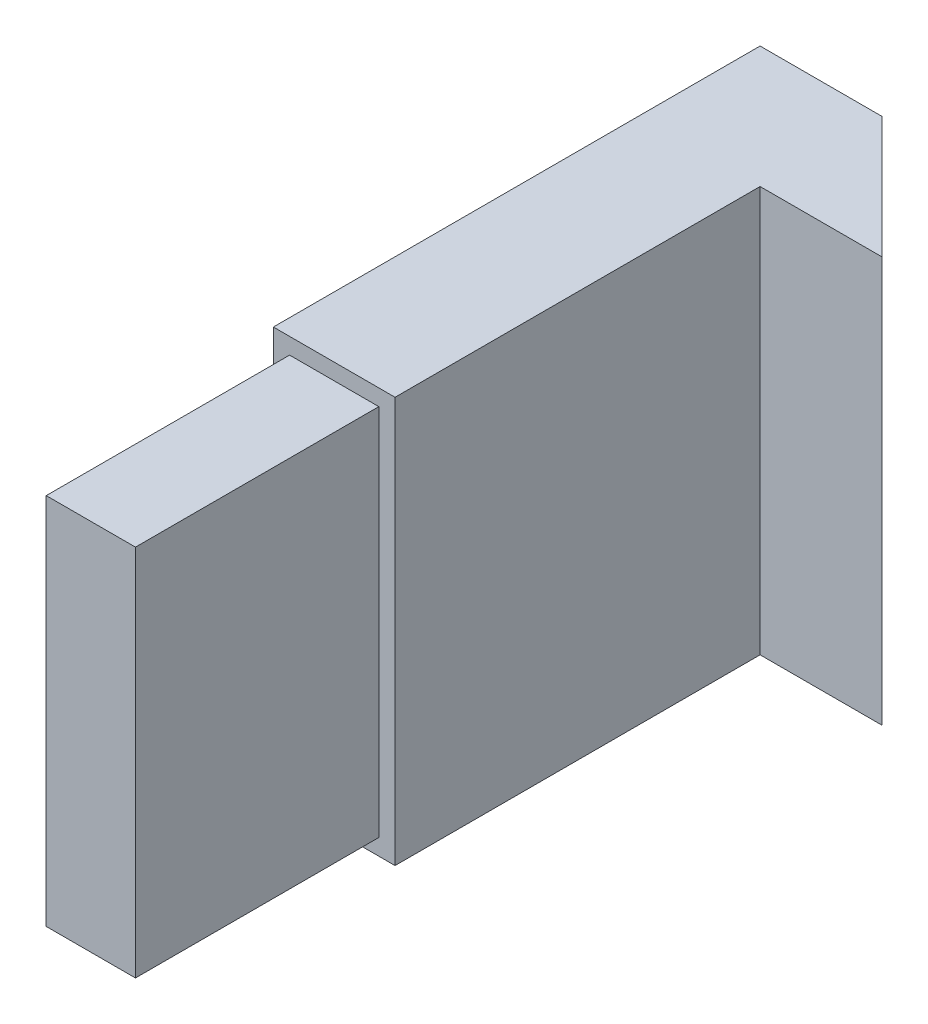
ISO-10303-21;
HEADER;
FILE_DESCRIPTION(('STEP AP214'),'2;1');
FILE_NAME('part.step','',(''),(''),'','','');
FILE_SCHEMA(('AUTOMOTIVE_DESIGN { 1 0 10303 214 1 1 1 1 }'));
ENDSEC;
DATA;
#1=APPLICATION_CONTEXT('core data for automotive mechanical design processes');
#2=APPLICATION_PROTOCOL_DEFINITION('international standard','automotive_design',2000,#1);
#3=PRODUCT_CONTEXT('',#1,'mechanical');
#4=PRODUCT('Part','Part','',(#3));
#5=PRODUCT_RELATED_PRODUCT_CATEGORY('part','',(#4));
#6=PRODUCT_DEFINITION_FORMATION('','',#4);
#7=PRODUCT_DEFINITION_CONTEXT('part definition',#1,'design');
#8=PRODUCT_DEFINITION('design','',#6,#7);
#9=PRODUCT_DEFINITION_SHAPE('','',#8);
#10=(LENGTH_UNIT() NAMED_UNIT(*) SI_UNIT(.MILLI.,.METRE.));
#11=(NAMED_UNIT(*) PLANE_ANGLE_UNIT() SI_UNIT($,.RADIAN.));
#12=(NAMED_UNIT(*) SI_UNIT($,.STERADIAN.) SOLID_ANGLE_UNIT());
#13=UNCERTAINTY_MEASURE_WITH_UNIT(LENGTH_MEASURE(1.E-05),#10,'distance_accuracy_value','');
#14=(GEOMETRIC_REPRESENTATION_CONTEXT(3) GLOBAL_UNCERTAINTY_ASSIGNED_CONTEXT((#13)) GLOBAL_UNIT_ASSIGNED_CONTEXT((#10,
#11,#12)) REPRESENTATION_CONTEXT('',''));
#15=CARTESIAN_POINT('',(0.,0.,0.));
#16=DIRECTION('',(0.,0.,1.));
#17=DIRECTION('',(1.,0.,0.));
#18=AXIS2_PLACEMENT_3D('',#15,#16,#17);
#19=CARTESIAN_POINT('',(0.,5.,3.));
#20=DIRECTION('',(0.,0.,-1.));
#21=DIRECTION('',(-1.,0.,0.));
#22=AXIS2_PLACEMENT_3D('',#19,#20,#21);
#23=PLANE('',#22);
#24=DIRECTION('',(1.,0.,0.));
#25=VECTOR('',#24,1.);
#26=CARTESIAN_POINT('',(0.,0.,3.));
#27=LINE('',#26,#25);
#28=CARTESIAN_POINT('',(-0.749999999999999,0.,3.));
#29=VERTEX_POINT('',#28);
#30=CARTESIAN_POINT('',(0.75,0.,3.));
#31=VERTEX_POINT('',#30);
#32=EDGE_CURVE('E145',#29,#31,#27,.T.);
#33=ORIENTED_EDGE('',*,*,#32,.T.);
#34=DIRECTION('',(0.,-1.,0.));
#35=VECTOR('',#34,1.);
#36=CARTESIAN_POINT('',(0.75,5.,3.));
#37=LINE('',#36,#35);
#38=CARTESIAN_POINT('',(0.75,5.,3.));
#39=VERTEX_POINT('',#38);
#40=EDGE_CURVE('E155',#39,#31,#37,.T.);
#41=ORIENTED_EDGE('',*,*,#40,.F.);
#42=DIRECTION('',(1.,0.,0.));
#43=VECTOR('',#42,1.);
#44=CARTESIAN_POINT('',(0.,5.,3.));
#45=LINE('',#44,#43);
#46=CARTESIAN_POINT('',(-0.749999999999999,5.,3.));
#47=VERTEX_POINT('',#46);
#48=EDGE_CURVE('E154',#47,#39,#45,.T.);
#49=ORIENTED_EDGE('',*,*,#48,.F.);
#50=DIRECTION('',(0.,-1.,0.));
#51=VECTOR('',#50,1.);
#52=CARTESIAN_POINT('',(-0.749999999999999,5.,3.));
#53=LINE('',#52,#51);
#54=EDGE_CURVE('E169',#47,#29,#53,.T.);
#55=ORIENTED_EDGE('',*,*,#54,.T.);
#56=EDGE_LOOP('',(#33,#41,#49,#55));
#57=FACE_BOUND('',#56,.T.);
#58=DIRECTION('',(0.,-1.,0.));
#59=VECTOR('',#58,1.);
#60=CARTESIAN_POINT('',(-0.549999999999999,4.8,3.));
#61=LINE('',#60,#59);
#62=CARTESIAN_POINT('',(-0.549999999999999,4.8,3.));
#63=VERTEX_POINT('',#62);
#64=CARTESIAN_POINT('',(-0.549999999999999,0.2,3.));
#65=VERTEX_POINT('',#64);
#66=EDGE_CURVE('E131',#63,#65,#61,.T.);
#67=ORIENTED_EDGE('',*,*,#66,.F.);
#68=DIRECTION('',(-1.,0.,0.));
#69=VECTOR('',#68,1.);
#70=CARTESIAN_POINT('',(0.55,4.8,3.));
#71=LINE('',#70,#69);
#72=CARTESIAN_POINT('',(0.55,4.8,3.));
#73=VERTEX_POINT('',#72);
#74=EDGE_CURVE('E128',#73,#63,#71,.T.);
#75=ORIENTED_EDGE('',*,*,#74,.F.);
#76=DIRECTION('',(0.,1.,0.));
#77=VECTOR('',#76,1.);
#78=CARTESIAN_POINT('',(0.55,0.2,3.));
#79=LINE('',#78,#77);
#80=CARTESIAN_POINT('',(0.55,0.2,3.));
#81=VERTEX_POINT('',#80);
#82=EDGE_CURVE('E55',#81,#73,#79,.T.);
#83=ORIENTED_EDGE('',*,*,#82,.F.);
#84=DIRECTION('',(1.,0.,0.));
#85=VECTOR('',#84,1.);
#86=CARTESIAN_POINT('',(-0.549999999999999,0.2,3.));
#87=LINE('',#86,#85);
#88=EDGE_CURVE('E50',#65,#81,#87,.T.);
#89=ORIENTED_EDGE('',*,*,#88,.F.);
#90=EDGE_LOOP('',(#67,#75,#83,#89));
#91=FACE_BOUND('',#90,.T.);
#92=ADVANCED_FACE('F35',(#57,#91),#23,.F.);
#93=CARTESIAN_POINT('',(0.75,5.,0.));
#94=DIRECTION('',(1.,0.,0.));
#95=DIRECTION('',(0.,0.,-1.));
#96=AXIS2_PLACEMENT_3D('',#93,#94,#95);
#97=PLANE('',#96);
#98=DIRECTION('',(0.,0.,1.));
#99=VECTOR('',#98,1.);
#100=CARTESIAN_POINT('',(0.75,0.,0.));
#101=LINE('',#100,#99);
#102=CARTESIAN_POINT('',(0.75,0.,-1.5));
#103=VERTEX_POINT('',#102);
#104=EDGE_CURVE('E132',#103,#31,#101,.T.);
#105=ORIENTED_EDGE('',*,*,#104,.F.);
#106=DIRECTION('',(0.,-1.,0.));
#107=VECTOR('',#106,1.);
#108=CARTESIAN_POINT('',(0.75,5.,-1.5));
#109=LINE('',#108,#107);
#110=CARTESIAN_POINT('',(0.75,5.,-1.5));
#111=VERTEX_POINT('',#110);
#112=EDGE_CURVE('E11',#111,#103,#109,.T.);
#113=ORIENTED_EDGE('',*,*,#112,.F.);
#114=DIRECTION('',(0.,0.,1.));
#115=VECTOR('',#114,1.);
#116=CARTESIAN_POINT('',(0.75,5.,0.));
#117=LINE('',#116,#115);
#118=EDGE_CURVE('E141',#111,#39,#117,.T.);
#119=ORIENTED_EDGE('',*,*,#118,.T.);
#120=ORIENTED_EDGE('',*,*,#40,.T.);
#121=EDGE_LOOP('',(#105,#113,#119,#120));
#122=FACE_BOUND('',#121,.T.);
#123=ADVANCED_FACE('F37',(#122),#97,.T.);
#124=CARTESIAN_POINT('',(0.,5.,-1.5));
#125=DIRECTION('',(0.,0.,-1.));
#126=DIRECTION('',(-1.,0.,0.));
#127=AXIS2_PLACEMENT_3D('',#124,#125,#126);
#128=PLANE('',#127);
#129=DIRECTION('',(1.,0.,0.));
#130=VECTOR('',#129,1.);
#131=CARTESIAN_POINT('',(0.,0.,-1.5));
#132=LINE('',#131,#130);
#133=CARTESIAN_POINT('',(2.25,0.,-1.5));
#134=VERTEX_POINT('',#133);
#135=EDGE_CURVE('E135',#103,#134,#132,.T.);
#136=ORIENTED_EDGE('',*,*,#135,.T.);
#137=DIRECTION('',(0.,-1.,0.));
#138=VECTOR('',#137,1.);
#139=CARTESIAN_POINT('',(2.25,5.,-1.5));
#140=LINE('',#139,#138);
#141=CARTESIAN_POINT('',(2.25,5.,-1.5));
#142=VERTEX_POINT('',#141);
#143=EDGE_CURVE('E43',#142,#134,#140,.T.);
#144=ORIENTED_EDGE('',*,*,#143,.F.);
#145=DIRECTION('',(1.,0.,0.));
#146=VECTOR('',#145,1.);
#147=CARTESIAN_POINT('',(0.,5.,-1.5));
#148=LINE('',#147,#146);
#149=EDGE_CURVE('E144',#111,#142,#148,.T.);
#150=ORIENTED_EDGE('',*,*,#149,.F.);
#151=ORIENTED_EDGE('',*,*,#112,.T.);
#152=EDGE_LOOP('',(#136,#144,#150,#151));
#153=FACE_BOUND('',#152,.T.);
#154=ADVANCED_FACE('F199',(#153),#128,.F.);
#155=CARTESIAN_POINT('',(1.875,5.,-1.875));
#156=DIRECTION('',(-0.707106781186548,0.,0.707106781186547));
#157=DIRECTION('',(0.707106781186547,0.,0.707106781186548));
#158=AXIS2_PLACEMENT_3D('',#155,#156,#157);
#159=PLANE('',#158);
#160=DIRECTION('',(-0.707106781186547,0.,-0.707106781186548));
#161=VECTOR('',#160,1.);
#162=CARTESIAN_POINT('',(1.875,0.,-1.875));
#163=LINE('',#162,#161);
#164=CARTESIAN_POINT('',(0.75,0.,-3.));
#165=VERTEX_POINT('',#164);
#166=EDGE_CURVE('E158',#134,#165,#163,.T.);
#167=ORIENTED_EDGE('',*,*,#166,.T.);
#168=DIRECTION('',(0.,-1.,0.));
#169=VECTOR('',#168,1.);
#170=CARTESIAN_POINT('',(0.75,5.,-3.));
#171=LINE('',#170,#169);
#172=CARTESIAN_POINT('',(0.75,5.,-3.));
#173=VERTEX_POINT('',#172);
#174=EDGE_CURVE('E174',#173,#165,#171,.T.);
#175=ORIENTED_EDGE('',*,*,#174,.F.);
#176=DIRECTION('',(-0.707106781186547,0.,-0.707106781186548));
#177=VECTOR('',#176,1.);
#178=CARTESIAN_POINT('',(1.875,5.,-1.875));
#179=LINE('',#178,#177);
#180=EDGE_CURVE('E147',#142,#173,#179,.T.);
#181=ORIENTED_EDGE('',*,*,#180,.F.);
#182=ORIENTED_EDGE('',*,*,#143,.T.);
#183=EDGE_LOOP('',(#167,#175,#181,#182));
#184=FACE_BOUND('',#183,.T.);
#185=ADVANCED_FACE('F180',(#184),#159,.F.);
#186=CARTESIAN_POINT('',(0.,5.,-3.));
#187=DIRECTION('',(0.,0.,-1.));
#188=DIRECTION('',(-1.,0.,0.));
#189=AXIS2_PLACEMENT_3D('',#186,#187,#188);
#190=PLANE('',#189);
#191=DIRECTION('',(1.,0.,0.));
#192=VECTOR('',#191,1.);
#193=CARTESIAN_POINT('',(0.,0.,-3.));
#194=LINE('',#193,#192);
#195=CARTESIAN_POINT('',(-0.75,0.,-3.));
#196=VERTEX_POINT('',#195);
#197=EDGE_CURVE('E161',#196,#165,#194,.T.);
#198=ORIENTED_EDGE('',*,*,#197,.F.);
#199=DIRECTION('',(0.,-1.,0.));
#200=VECTOR('',#199,1.);
#201=CARTESIAN_POINT('',(-0.75,5.,-3.));
#202=LINE('',#201,#200);
#203=CARTESIAN_POINT('',(-0.75,5.,-3.));
#204=VERTEX_POINT('',#203);
#205=EDGE_CURVE('E172',#204,#196,#202,.T.);
#206=ORIENTED_EDGE('',*,*,#205,.F.);
#207=DIRECTION('',(1.,0.,0.));
#208=VECTOR('',#207,1.);
#209=CARTESIAN_POINT('',(0.,5.,-3.));
#210=LINE('',#209,#208);
#211=EDGE_CURVE('E149',#204,#173,#210,.T.);
#212=ORIENTED_EDGE('',*,*,#211,.T.);
#213=ORIENTED_EDGE('',*,*,#174,.T.);
#214=EDGE_LOOP('',(#198,#206,#212,#213));
#215=FACE_BOUND('',#214,.T.);
#216=ADVANCED_FACE('F192',(#215),#190,.T.);
#217=CARTESIAN_POINT('',(-0.75,5.,0.));
#218=DIRECTION('',(1.,0.,0.));
#219=DIRECTION('',(0.,0.,-1.));
#220=AXIS2_PLACEMENT_3D('',#217,#218,#219);
#221=PLANE('',#220);
#222=DIRECTION('',(0.,0.,1.));
#223=VECTOR('',#222,1.);
#224=CARTESIAN_POINT('',(-0.75,0.,0.));
#225=LINE('',#224,#223);
#226=EDGE_CURVE('E164',#196,#29,#225,.T.);
#227=ORIENTED_EDGE('',*,*,#226,.T.);
#228=ORIENTED_EDGE('',*,*,#54,.F.);
#229=DIRECTION('',(0.,0.,1.));
#230=VECTOR('',#229,1.);
#231=CARTESIAN_POINT('',(-0.75,5.,0.));
#232=LINE('',#231,#230);
#233=EDGE_CURVE('E152',#204,#47,#232,.T.);
#234=ORIENTED_EDGE('',*,*,#233,.F.);
#235=ORIENTED_EDGE('',*,*,#205,.T.);
#236=EDGE_LOOP('',(#227,#228,#234,#235));
#237=FACE_BOUND('',#236,.T.);
#238=ADVANCED_FACE('F205',(#237),#221,.F.);
#239=CARTESIAN_POINT('',(0.,5.,0.));
#240=DIRECTION('',(0.,1.,0.));
#241=DIRECTION('',(0.,0.,1.));
#242=AXIS2_PLACEMENT_3D('',#239,#240,#241);
#243=PLANE('',#242);
#244=ORIENTED_EDGE('',*,*,#118,.F.);
#245=ORIENTED_EDGE('',*,*,#149,.T.);
#246=ORIENTED_EDGE('',*,*,#180,.T.);
#247=ORIENTED_EDGE('',*,*,#211,.F.);
#248=ORIENTED_EDGE('',*,*,#233,.T.);
#249=ORIENTED_EDGE('',*,*,#48,.T.);
#250=EDGE_LOOP('',(#244,#245,#246,#247,#248,#249));
#251=FACE_BOUND('',#250,.T.);
#252=ADVANCED_FACE('F197',(#251),#243,.T.);
#253=CARTESIAN_POINT('',(0.,0.,0.));
#254=DIRECTION('',(0.,1.,0.));
#255=DIRECTION('',(0.,0.,1.));
#256=AXIS2_PLACEMENT_3D('',#253,#254,#255);
#257=PLANE('',#256);
#258=ORIENTED_EDGE('',*,*,#104,.T.);
#259=ORIENTED_EDGE('',*,*,#32,.F.);
#260=ORIENTED_EDGE('',*,*,#226,.F.);
#261=ORIENTED_EDGE('',*,*,#197,.T.);
#262=ORIENTED_EDGE('',*,*,#166,.F.);
#263=ORIENTED_EDGE('',*,*,#135,.F.);
#264=EDGE_LOOP('',(#258,#259,#260,#261,#262,#263));
#265=FACE_BOUND('',#264,.T.);
#266=ADVANCED_FACE('F186',(#265),#257,.F.);
#267=CARTESIAN_POINT('',(-0.549999999999999,4.8,6.));
#268=DIRECTION('',(1.,0.,0.));
#269=DIRECTION('',(0.,0.,-1.));
#270=AXIS2_PLACEMENT_3D('',#267,#268,#269);
#271=PLANE('',#270);
#272=ORIENTED_EDGE('',*,*,#66,.T.);
#273=DIRECTION('',(0.,0.,-1.));
#274=VECTOR('',#273,1.);
#275=CARTESIAN_POINT('',(-0.549999999999999,0.2,6.));
#276=LINE('',#275,#274);
#277=CARTESIAN_POINT('',(-0.549999999999999,0.2,6.));
#278=VERTEX_POINT('',#277);
#279=EDGE_CURVE('E112',#278,#65,#276,.T.);
#280=ORIENTED_EDGE('',*,*,#279,.F.);
#281=DIRECTION('',(0.,-1.,0.));
#282=VECTOR('',#281,1.);
#283=CARTESIAN_POINT('',(-0.549999999999999,4.8,6.));
#284=LINE('',#283,#282);
#285=CARTESIAN_POINT('',(-0.549999999999999,4.8,6.));
#286=VERTEX_POINT('',#285);
#287=EDGE_CURVE('E119',#286,#278,#284,.T.);
#288=ORIENTED_EDGE('',*,*,#287,.F.);
#289=DIRECTION('',(0.,0.,-1.));
#290=VECTOR('',#289,1.);
#291=CARTESIAN_POINT('',(-0.549999999999999,4.8,6.));
#292=LINE('',#291,#290);
#293=EDGE_CURVE('E320',#286,#63,#292,.T.);
#294=ORIENTED_EDGE('',*,*,#293,.T.);
#295=EDGE_LOOP('',(#272,#280,#288,#294));
#296=FACE_BOUND('',#295,.T.);
#297=ADVANCED_FACE('F130',(#296),#271,.F.);
#298=CARTESIAN_POINT('',(-0.549999999999999,0.2,6.));
#299=DIRECTION('',(0.,1.,0.));
#300=DIRECTION('',(0.,0.,1.));
#301=AXIS2_PLACEMENT_3D('',#298,#299,#300);
#302=PLANE('',#301);
#303=ORIENTED_EDGE('',*,*,#88,.T.);
#304=DIRECTION('',(0.,0.,-1.));
#305=VECTOR('',#304,1.);
#306=CARTESIAN_POINT('',(0.55,0.2,6.));
#307=LINE('',#306,#305);
#308=CARTESIAN_POINT('',(0.55,0.2,6.));
#309=VERTEX_POINT('',#308);
#310=EDGE_CURVE('E115',#309,#81,#307,.T.);
#311=ORIENTED_EDGE('',*,*,#310,.F.);
#312=DIRECTION('',(1.,0.,0.));
#313=VECTOR('',#312,1.);
#314=CARTESIAN_POINT('',(-0.549999999999999,0.2,6.));
#315=LINE('',#314,#313);
#316=EDGE_CURVE('E108',#278,#309,#315,.T.);
#317=ORIENTED_EDGE('',*,*,#316,.F.);
#318=ORIENTED_EDGE('',*,*,#279,.T.);
#319=EDGE_LOOP('',(#303,#311,#317,#318));
#320=FACE_BOUND('',#319,.T.);
#321=ADVANCED_FACE('F110',(#320),#302,.F.);
#322=CARTESIAN_POINT('',(0.55,0.2,6.));
#323=DIRECTION('',(-1.,0.,0.));
#324=DIRECTION('',(0.,0.,1.));
#325=AXIS2_PLACEMENT_3D('',#322,#323,#324);
#326=PLANE('',#325);
#327=ORIENTED_EDGE('',*,*,#82,.T.);
#328=DIRECTION('',(0.,0.,-1.));
#329=VECTOR('',#328,1.);
#330=CARTESIAN_POINT('',(0.55,4.8,6.));
#331=LINE('',#330,#329);
#332=CARTESIAN_POINT('',(0.55,4.8,6.));
#333=VERTEX_POINT('',#332);
#334=EDGE_CURVE('E137',#333,#73,#331,.T.);
#335=ORIENTED_EDGE('',*,*,#334,.F.);
#336=DIRECTION('',(0.,1.,0.));
#337=VECTOR('',#336,1.);
#338=CARTESIAN_POINT('',(0.55,0.2,6.));
#339=LINE('',#338,#337);
#340=EDGE_CURVE('E118',#309,#333,#339,.T.);
#341=ORIENTED_EDGE('',*,*,#340,.F.);
#342=ORIENTED_EDGE('',*,*,#310,.T.);
#343=EDGE_LOOP('',(#327,#335,#341,#342));
#344=FACE_BOUND('',#343,.T.);
#345=ADVANCED_FACE('F226',(#344),#326,.F.);
#346=CARTESIAN_POINT('',(0.55,4.8,6.));
#347=DIRECTION('',(0.,-1.,0.));
#348=DIRECTION('',(0.,0.,-1.));
#349=AXIS2_PLACEMENT_3D('',#346,#347,#348);
#350=PLANE('',#349);
#351=ORIENTED_EDGE('',*,*,#74,.T.);
#352=ORIENTED_EDGE('',*,*,#293,.F.);
#353=DIRECTION('',(-1.,0.,0.));
#354=VECTOR('',#353,1.);
#355=CARTESIAN_POINT('',(0.55,4.8,6.));
#356=LINE('',#355,#354);
#357=EDGE_CURVE('E124',#333,#286,#356,.T.);
#358=ORIENTED_EDGE('',*,*,#357,.F.);
#359=ORIENTED_EDGE('',*,*,#334,.T.);
#360=EDGE_LOOP('',(#351,#352,#358,#359));
#361=FACE_BOUND('',#360,.T.);
#362=ADVANCED_FACE('F229',(#361),#350,.F.);
#363=CARTESIAN_POINT('',(0.,0.,6.));
#364=DIRECTION('',(0.,0.,1.));
#365=DIRECTION('',(1.,0.,0.));
#366=AXIS2_PLACEMENT_3D('',#363,#364,#365);
#367=PLANE('',#366);
#368=ORIENTED_EDGE('',*,*,#287,.T.);
#369=ORIENTED_EDGE('',*,*,#316,.T.);
#370=ORIENTED_EDGE('',*,*,#340,.T.);
#371=ORIENTED_EDGE('',*,*,#357,.T.);
#372=EDGE_LOOP('',(#368,#369,#370,#371));
#373=FACE_BOUND('',#372,.T.);
#374=ADVANCED_FACE('F122',(#373),#367,.T.);
#375=CLOSED_SHELL('',(#92,#123,#154,#185,#216,#238,#252,#266,#297,#321,#345,#362,#374));
#376=MANIFOLD_SOLID_BREP('B2',#375);
#377=ADVANCED_BREP_SHAPE_REPRESENTATION('',(#18,#376),#14);
#378=SHAPE_DEFINITION_REPRESENTATION(#9,#377);
ENDSEC;
END-ISO-10303-21;
